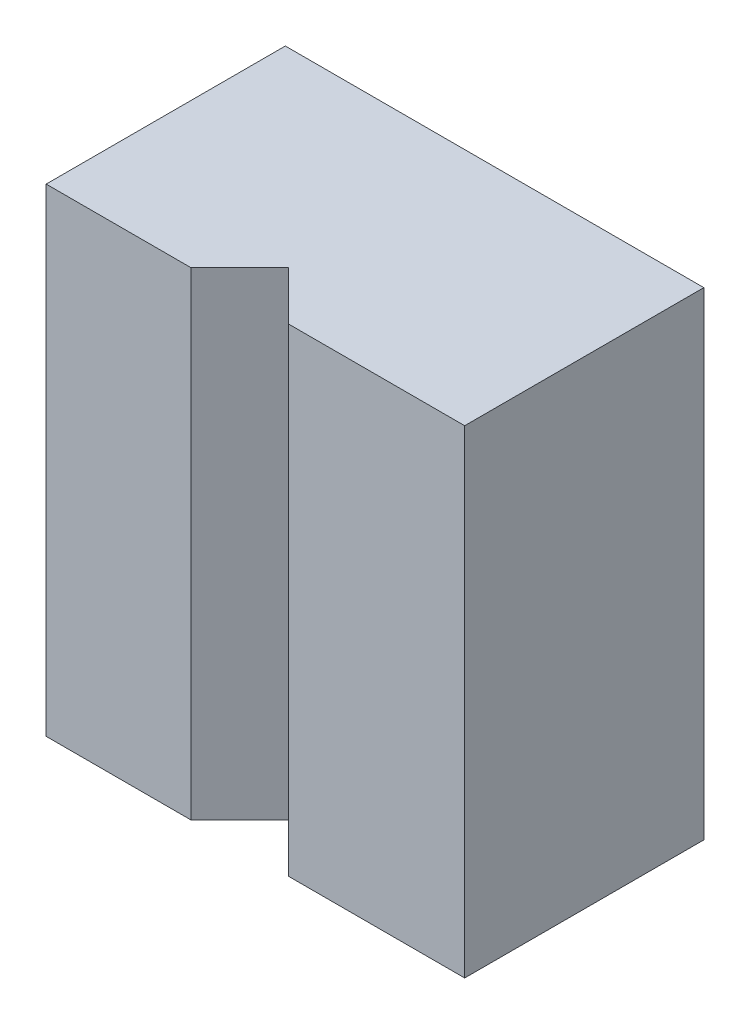
ISO-10303-21;
HEADER;
FILE_DESCRIPTION(('STEP AP214'),'2;1');
FILE_NAME('part.step','',(''),(''),'','','');
FILE_SCHEMA(('AUTOMOTIVE_DESIGN { 1 0 10303 214 1 1 1 1 }'));
ENDSEC;
DATA;
#1=APPLICATION_CONTEXT('core data for automotive mechanical design processes');
#2=APPLICATION_PROTOCOL_DEFINITION('international standard','automotive_design',2000,#1);
#3=PRODUCT_CONTEXT('',#1,'mechanical');
#4=PRODUCT('Part','Part','',(#3));
#5=PRODUCT_RELATED_PRODUCT_CATEGORY('part','',(#4));
#6=PRODUCT_DEFINITION_FORMATION('','',#4);
#7=PRODUCT_DEFINITION_CONTEXT('part definition',#1,'design');
#8=PRODUCT_DEFINITION('design','',#6,#7);
#9=PRODUCT_DEFINITION_SHAPE('','',#8);
#10=(LENGTH_UNIT() NAMED_UNIT(*) SI_UNIT(.MILLI.,.METRE.));
#11=(NAMED_UNIT(*) PLANE_ANGLE_UNIT() SI_UNIT($,.RADIAN.));
#12=(NAMED_UNIT(*) SI_UNIT($,.STERADIAN.) SOLID_ANGLE_UNIT());
#13=UNCERTAINTY_MEASURE_WITH_UNIT(LENGTH_MEASURE(1.E-05),#10,'distance_accuracy_value','');
#14=(GEOMETRIC_REPRESENTATION_CONTEXT(3) GLOBAL_UNCERTAINTY_ASSIGNED_CONTEXT((#13)) GLOBAL_UNIT_ASSIGNED_CONTEXT((#10,
#11,#12)) REPRESENTATION_CONTEXT('',''));
#15=CARTESIAN_POINT('',(0.,0.,0.));
#16=DIRECTION('',(0.,0.,1.));
#17=DIRECTION('',(1.,0.,0.));
#18=AXIS2_PLACEMENT_3D('',#15,#16,#17);
#19=CARTESIAN_POINT('',(0.,101.6,0.));
#20=DIRECTION('',(0.,0.,-1.));
#21=DIRECTION('',(-1.,0.,0.));
#22=AXIS2_PLACEMENT_3D('',#19,#20,#21);
#23=PLANE('',#22);
#24=DIRECTION('',(1.,0.,0.));
#25=VECTOR('',#24,1.);
#26=CARTESIAN_POINT('',(0.,101.6,0.));
#27=LINE('',#26,#25);
#28=CARTESIAN_POINT('',(-88.9,101.6,0.));
#29=VERTEX_POINT('',#28);
#30=CARTESIAN_POINT('',(-58.1195890784586,101.6,0.));
#31=VERTEX_POINT('',#30);
#32=EDGE_CURVE('E109',#29,#31,#27,.T.);
#33=ORIENTED_EDGE('',*,*,#32,.F.);
#34=DIRECTION('',(0.,-1.,0.));
#35=VECTOR('',#34,1.);
#36=CARTESIAN_POINT('',(-88.9,101.6,0.));
#37=LINE('',#36,#35);
#38=CARTESIAN_POINT('',(-88.9,0.,0.));
#39=VERTEX_POINT('',#38);
#40=EDGE_CURVE('E96',#29,#39,#37,.T.);
#41=ORIENTED_EDGE('',*,*,#40,.T.);
#42=DIRECTION('',(1.,0.,0.));
#43=VECTOR('',#42,1.);
#44=CARTESIAN_POINT('',(0.,0.,0.));
#45=LINE('',#44,#43);
#46=CARTESIAN_POINT('',(-58.1195890784586,0.,0.));
#47=VERTEX_POINT('',#46);
#48=EDGE_CURVE('E139',#39,#47,#45,.T.);
#49=ORIENTED_EDGE('',*,*,#48,.T.);
#50=DIRECTION('',(0.,-1.,0.));
#51=VECTOR('',#50,1.);
#52=CARTESIAN_POINT('',(-58.1195890784589,419.1,3.04893075443057E-13));
#53=LINE('',#52,#51);
#54=EDGE_CURVE('E116',#31,#47,#53,.T.);
#55=ORIENTED_EDGE('',*,*,#54,.F.);
#56=EDGE_LOOP('',(#33,#41,#49,#55));
#57=FACE_BOUND('',#56,.T.);
#58=ADVANCED_FACE('F38',(#57),#23,.F.);
#59=CARTESIAN_POINT('',(0.,101.6,0.));
#60=DIRECTION('',(0.,1.,0.));
#61=DIRECTION('',(0.,0.,1.));
#62=AXIS2_PLACEMENT_3D('',#59,#60,#61);
#63=PLANE('',#62);
#64=DIRECTION('',(0.,0.,1.));
#65=VECTOR('',#64,1.);
#66=CARTESIAN_POINT('',(-88.9,101.6,0.));
#67=LINE('',#66,#65);
#68=CARTESIAN_POINT('',(-88.9,101.6,-50.8));
#69=VERTEX_POINT('',#68);
#70=EDGE_CURVE('E54',#69,#29,#67,.T.);
#71=ORIENTED_EDGE('',*,*,#70,.T.);
#72=ORIENTED_EDGE('',*,*,#32,.T.);
#73=DIRECTION('',(0.707106781186543,0.,-0.707106781186552));
#74=VECTOR('',#73,1.);
#75=CARTESIAN_POINT('',(-29.0597945392296,101.6,-29.0597945392293));
#76=LINE('',#75,#74);
#77=CARTESIAN_POINT('',(-47.7922945392294,101.6,-10.3272945392293));
#78=VERTEX_POINT('',#77);
#79=EDGE_CURVE('E62',#31,#78,#76,.T.);
#80=ORIENTED_EDGE('',*,*,#79,.T.);
#81=DIRECTION('',(0.707106781186552,0.,0.707106781186543));
#82=VECTOR('',#81,1.);
#83=CARTESIAN_POINT('',(-18.7324999999998,101.6,18.7325));
#84=LINE('',#83,#82);
#85=CARTESIAN_POINT('',(-37.465,101.6,0.));
#86=VERTEX_POINT('',#85);
#87=EDGE_CURVE('E134',#78,#86,#84,.T.);
#88=ORIENTED_EDGE('',*,*,#87,.T.);
#89=CARTESIAN_POINT('',(0.,101.6,0.));
#90=VERTEX_POINT('',#89);
#91=EDGE_CURVE('E119',#86,#90,#27,.T.);
#92=ORIENTED_EDGE('',*,*,#91,.T.);
#93=DIRECTION('',(0.,0.,-1.));
#94=VECTOR('',#93,1.);
#95=CARTESIAN_POINT('',(0.,101.6,0.));
#96=LINE('',#95,#94);
#97=CARTESIAN_POINT('',(0.,101.6,-50.8));
#98=VERTEX_POINT('',#97);
#99=EDGE_CURVE('E141',#90,#98,#96,.T.);
#100=ORIENTED_EDGE('',*,*,#99,.T.);
#101=DIRECTION('',(-1.,0.,0.));
#102=VECTOR('',#101,1.);
#103=CARTESIAN_POINT('',(0.,101.6,-50.8));
#104=LINE('',#103,#102);
#105=EDGE_CURVE('E112',#98,#69,#104,.T.);
#106=ORIENTED_EDGE('',*,*,#105,.T.);
#107=EDGE_LOOP('',(#71,#72,#80,#88,#92,#100,#106));
#108=FACE_BOUND('',#107,.T.);
#109=ADVANCED_FACE('F108',(#108),#63,.T.);
#110=CARTESIAN_POINT('',(0.,0.,0.));
#111=DIRECTION('',(0.,1.,0.));
#112=DIRECTION('',(0.,0.,1.));
#113=AXIS2_PLACEMENT_3D('',#110,#111,#112);
#114=PLANE('',#113);
#115=ORIENTED_EDGE('',*,*,#48,.F.);
#116=DIRECTION('',(0.,0.,1.));
#117=VECTOR('',#116,1.);
#118=CARTESIAN_POINT('',(-88.9,0.,0.));
#119=LINE('',#118,#117);
#120=CARTESIAN_POINT('',(-88.9,0.,-50.8));
#121=VERTEX_POINT('',#120);
#122=EDGE_CURVE('E99',#121,#39,#119,.T.);
#123=ORIENTED_EDGE('',*,*,#122,.F.);
#124=DIRECTION('',(-1.,0.,0.));
#125=VECTOR('',#124,1.);
#126=CARTESIAN_POINT('',(0.,0.,-50.8));
#127=LINE('',#126,#125);
#128=CARTESIAN_POINT('',(0.,0.,-50.8));
#129=VERTEX_POINT('',#128);
#130=EDGE_CURVE('E133',#129,#121,#127,.T.);
#131=ORIENTED_EDGE('',*,*,#130,.F.);
#132=DIRECTION('',(0.,0.,-1.));
#133=VECTOR('',#132,1.);
#134=CARTESIAN_POINT('',(0.,0.,0.));
#135=LINE('',#134,#133);
#136=CARTESIAN_POINT('',(0.,0.,0.));
#137=VERTEX_POINT('',#136);
#138=EDGE_CURVE('E129',#137,#129,#135,.T.);
#139=ORIENTED_EDGE('',*,*,#138,.F.);
#140=CARTESIAN_POINT('',(-37.465,0.,0.));
#141=VERTEX_POINT('',#140);
#142=EDGE_CURVE('E138',#141,#137,#45,.T.);
#143=ORIENTED_EDGE('',*,*,#142,.F.);
#144=DIRECTION('',(0.707106781186552,0.,0.707106781186543));
#145=VECTOR('',#144,1.);
#146=CARTESIAN_POINT('',(-18.7324999999998,0.,18.7325));
#147=LINE('',#146,#145);
#148=CARTESIAN_POINT('',(-47.7922945392294,1.11022302462516E-13,-10.3272945392293));
#149=VERTEX_POINT('',#148);
#150=EDGE_CURVE('E11',#149,#141,#147,.T.);
#151=ORIENTED_EDGE('',*,*,#150,.F.);
#152=DIRECTION('',(0.707106781186543,0.,-0.707106781186552));
#153=VECTOR('',#152,1.);
#154=CARTESIAN_POINT('',(-29.0597945392296,0.,-29.0597945392293));
#155=LINE('',#154,#153);
#156=EDGE_CURVE('E47',#47,#149,#155,.T.);
#157=ORIENTED_EDGE('',*,*,#156,.F.);
#158=EDGE_LOOP('',(#115,#123,#131,#139,#143,#151,#157));
#159=FACE_BOUND('',#158,.T.);
#160=ADVANCED_FACE('F181',(#159),#114,.F.);
#161=CARTESIAN_POINT('',(0.,101.6,0.));
#162=DIRECTION('',(-1.,0.,0.));
#163=DIRECTION('',(0.,0.,1.));
#164=AXIS2_PLACEMENT_3D('',#161,#162,#163);
#165=PLANE('',#164);
#166=ORIENTED_EDGE('',*,*,#138,.T.);
#167=DIRECTION('',(0.,-1.,0.));
#168=VECTOR('',#167,1.);
#169=CARTESIAN_POINT('',(0.,101.6,-50.8));
#170=LINE('',#169,#168);
#171=EDGE_CURVE('E124',#98,#129,#170,.T.);
#172=ORIENTED_EDGE('',*,*,#171,.F.);
#173=ORIENTED_EDGE('',*,*,#99,.F.);
#174=DIRECTION('',(0.,-1.,0.));
#175=VECTOR('',#174,1.);
#176=CARTESIAN_POINT('',(0.,101.6,0.));
#177=LINE('',#176,#175);
#178=EDGE_CURVE('E118',#90,#137,#177,.T.);
#179=ORIENTED_EDGE('',*,*,#178,.T.);
#180=EDGE_LOOP('',(#166,#172,#173,#179));
#181=FACE_BOUND('',#180,.T.);
#182=ADVANCED_FACE('F40',(#181),#165,.F.);
#183=CARTESIAN_POINT('',(0.,101.6,-50.8));
#184=DIRECTION('',(0.,0.,1.));
#185=DIRECTION('',(1.,0.,0.));
#186=AXIS2_PLACEMENT_3D('',#183,#184,#185);
#187=PLANE('',#186);
#188=ORIENTED_EDGE('',*,*,#130,.T.);
#189=DIRECTION('',(0.,-1.,0.));
#190=VECTOR('',#189,1.);
#191=CARTESIAN_POINT('',(-88.9,101.6,-50.8));
#192=LINE('',#191,#190);
#193=EDGE_CURVE('E105',#69,#121,#192,.T.);
#194=ORIENTED_EDGE('',*,*,#193,.F.);
#195=ORIENTED_EDGE('',*,*,#105,.F.);
#196=ORIENTED_EDGE('',*,*,#171,.T.);
#197=EDGE_LOOP('',(#188,#194,#195,#196));
#198=FACE_BOUND('',#197,.T.);
#199=ADVANCED_FACE('F177',(#198),#187,.F.);
#200=ORIENTED_EDGE('',*,*,#91,.F.);
#201=DIRECTION('',(0.,-1.,0.));
#202=VECTOR('',#201,1.);
#203=CARTESIAN_POINT('',(-37.465,419.1,0.));
#204=LINE('',#203,#202);
#205=EDGE_CURVE('E159',#86,#141,#204,.T.);
#206=ORIENTED_EDGE('',*,*,#205,.T.);
#207=ORIENTED_EDGE('',*,*,#142,.T.);
#208=ORIENTED_EDGE('',*,*,#178,.F.);
#209=EDGE_LOOP('',(#200,#206,#207,#208));
#210=FACE_BOUND('',#209,.T.);
#211=ADVANCED_FACE('F185',(#210),#23,.F.);
#212=CARTESIAN_POINT('',(-37.465,419.1,0.));
#213=DIRECTION('',(-0.707106781186543,0.,0.707106781186552));
#214=DIRECTION('',(0.707106781186552,0.,0.707106781186543));
#215=AXIS2_PLACEMENT_3D('',#212,#213,#214);
#216=PLANE('',#215);
#217=ORIENTED_EDGE('',*,*,#87,.F.);
#218=DIRECTION('',(0.,-1.,0.));
#219=VECTOR('',#218,1.);
#220=CARTESIAN_POINT('',(-47.7922945392294,419.1,-10.3272945392293));
#221=LINE('',#220,#219);
#222=EDGE_CURVE('E104',#78,#149,#221,.T.);
#223=ORIENTED_EDGE('',*,*,#222,.T.);
#224=ORIENTED_EDGE('',*,*,#150,.T.);
#225=ORIENTED_EDGE('',*,*,#205,.F.);
#226=EDGE_LOOP('',(#217,#223,#224,#225));
#227=FACE_BOUND('',#226,.T.);
#228=ADVANCED_FACE('F154',(#227),#216,.T.);
#229=CARTESIAN_POINT('',(-47.7922945392294,419.1,-10.3272945392293));
#230=DIRECTION('',(0.707106781186552,0.,0.707106781186543));
#231=DIRECTION('',(0.707106781186543,0.,-0.707106781186552));
#232=AXIS2_PLACEMENT_3D('',#229,#230,#231);
#233=PLANE('',#232);
#234=ORIENTED_EDGE('',*,*,#79,.F.);
#235=ORIENTED_EDGE('',*,*,#54,.T.);
#236=ORIENTED_EDGE('',*,*,#156,.T.);
#237=ORIENTED_EDGE('',*,*,#222,.F.);
#238=EDGE_LOOP('',(#234,#235,#236,#237));
#239=FACE_BOUND('',#238,.T.);
#240=ADVANCED_FACE('F151',(#239),#233,.T.);
#241=CARTESIAN_POINT('',(-88.9,101.6,0.));
#242=DIRECTION('',(1.,0.,0.));
#243=DIRECTION('',(0.,0.,-1.));
#244=AXIS2_PLACEMENT_3D('',#241,#242,#243);
#245=PLANE('',#244);
#246=ORIENTED_EDGE('',*,*,#122,.T.);
#247=ORIENTED_EDGE('',*,*,#40,.F.);
#248=ORIENTED_EDGE('',*,*,#70,.F.);
#249=ORIENTED_EDGE('',*,*,#193,.T.);
#250=EDGE_LOOP('',(#246,#247,#248,#249));
#251=FACE_BOUND('',#250,.T.);
#252=ADVANCED_FACE('F97',(#251),#245,.F.);
#253=CLOSED_SHELL('',(#58,#109,#160,#182,#199,#211,#228,#240,#252));
#254=MANIFOLD_SOLID_BREP('B2',#253);
#255=ADVANCED_BREP_SHAPE_REPRESENTATION('',(#18,#254),#14);
#256=SHAPE_DEFINITION_REPRESENTATION(#9,#255);
ENDSEC;
END-ISO-10303-21;
